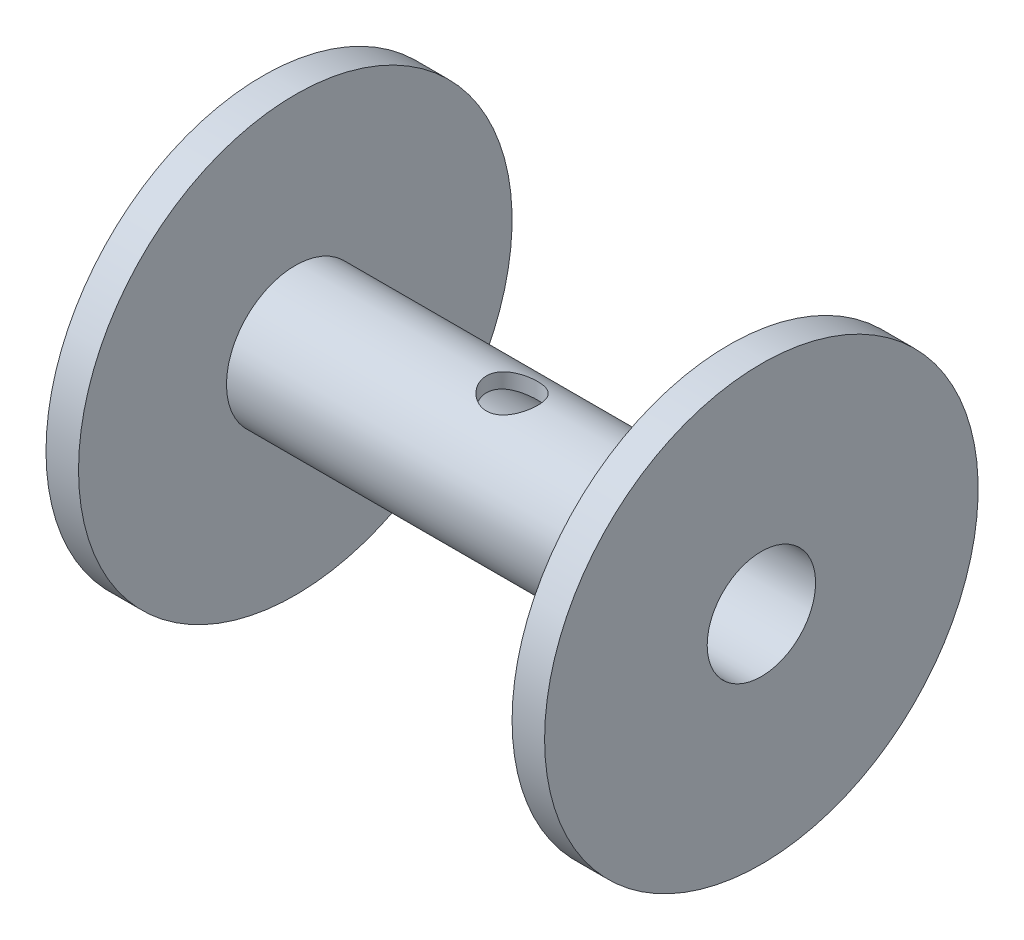
ISO-10303-21;
HEADER;
FILE_DESCRIPTION(('STEP AP214'),'2;1');
FILE_NAME('part.step','',(''),(''),'','','');
FILE_SCHEMA(('AUTOMOTIVE_DESIGN { 1 0 10303 214 1 1 1 1 }'));
ENDSEC;
DATA;
#1=APPLICATION_CONTEXT('core data for automotive mechanical design processes');
#2=APPLICATION_PROTOCOL_DEFINITION('international standard','automotive_design',2000,#1);
#3=PRODUCT_CONTEXT('',#1,'mechanical');
#4=PRODUCT('Part','Part','',(#3));
#5=PRODUCT_RELATED_PRODUCT_CATEGORY('part','',(#4));
#6=PRODUCT_DEFINITION_FORMATION('','',#4);
#7=PRODUCT_DEFINITION_CONTEXT('part definition',#1,'design');
#8=PRODUCT_DEFINITION('design','',#6,#7);
#9=PRODUCT_DEFINITION_SHAPE('','',#8);
#10=(LENGTH_UNIT() NAMED_UNIT(*) SI_UNIT(.MILLI.,.METRE.));
#11=(NAMED_UNIT(*) PLANE_ANGLE_UNIT() SI_UNIT($,.RADIAN.));
#12=(NAMED_UNIT(*) SI_UNIT($,.STERADIAN.) SOLID_ANGLE_UNIT());
#13=UNCERTAINTY_MEASURE_WITH_UNIT(LENGTH_MEASURE(1.E-05),#10,'distance_accuracy_value','');
#14=(GEOMETRIC_REPRESENTATION_CONTEXT(3) GLOBAL_UNCERTAINTY_ASSIGNED_CONTEXT((#13)) GLOBAL_UNIT_ASSIGNED_CONTEXT((#10,
#11,#12)) REPRESENTATION_CONTEXT('',''));
#15=CARTESIAN_POINT('',(0.,0.,0.));
#16=DIRECTION('',(0.,0.,1.));
#17=DIRECTION('',(1.,0.,0.));
#18=AXIS2_PLACEMENT_3D('',#15,#16,#17);
#19=CARTESIAN_POINT('',(-15.2755244755245,0.,0.));
#20=DIRECTION('',(-1.,0.,0.));
#21=DIRECTION('',(0.,0.,1.));
#22=AXIS2_PLACEMENT_3D('',#19,#20,#21);
#23=CYLINDRICAL_SURFACE('',#22,3.175);
#24=CARTESIAN_POINT('',(14.605,0.,0.));
#25=DIRECTION('',(-1.,0.,0.));
#26=DIRECTION('',(0.,0.,1.));
#27=AXIS2_PLACEMENT_3D('',#24,#25,#26);
#28=CIRCLE('',#27,3.175);
#29=CARTESIAN_POINT('',(14.605,0.,3.175));
#30=VERTEX_POINT('',#29);
#31=EDGE_CURVE('E76',#30,#30,#28,.T.);
#32=ORIENTED_EDGE('',*,*,#31,.F.);
#33=EDGE_LOOP('',(#32));
#34=FACE_BOUND('',#33,.T.);
#35=CARTESIAN_POINT('',(-14.605,0.,0.));
#36=DIRECTION('',(-1.,0.,0.));
#37=DIRECTION('',(0.,0.,1.));
#38=AXIS2_PLACEMENT_3D('',#35,#36,#37);
#39=CIRCLE('',#38,3.175);
#40=CARTESIAN_POINT('',(-14.605,0.,3.175));
#41=VERTEX_POINT('',#40);
#42=EDGE_CURVE('E70',#41,#41,#39,.T.);
#43=ORIENTED_EDGE('',*,*,#42,.T.);
#44=EDGE_LOOP('',(#43));
#45=FACE_BOUND('',#44,.T.);
#46=CARTESIAN_POINT('',(0.,2.7983253920872,-1.5));
#47=CARTESIAN_POINT('',(0.0788107476010317,2.79833097649977,-1.49999523547047));
#48=CARTESIAN_POINT('',(0.157735612205732,2.80170427159323,-1.49374832449328));
#49=CARTESIAN_POINT('',(0.313214667514685,2.81472644561665,-1.4690554061353));
#50=CARTESIAN_POINT('',(0.389762907162894,2.82438992585351,-1.45058101361493));
#51=CARTESIAN_POINT('',(0.537952673756733,2.84863009396432,-1.40237253355636));
#52=CARTESIAN_POINT('',(0.609616136431819,2.86318279906116,-1.37269332197988));
#53=CARTESIAN_POINT('',(0.74692939284759,2.89552502377023,-1.30308399064543));
#54=CARTESIAN_POINT('',(0.8125794422789,2.91331440566267,-1.26315430701281));
#55=CARTESIAN_POINT('',(0.941323245258398,2.95172227722859,-1.1707430871524));
#56=CARTESIAN_POINT('',(1.00387788849068,2.97245254188493,-1.11755658650795));
#57=CARTESIAN_POINT('',(1.11959143684936,3.01349951044786,-1.00161259672222));
#58=CARTESIAN_POINT('',(1.17274606260041,3.03381602228766,-0.938850772491945));
#59=CARTESIAN_POINT('',(1.27118937954777,3.07317288716969,-0.801034900704515));
#60=CARTESIAN_POINT('',(1.31583450125175,3.09206866660246,-0.725476017233364));
#61=CARTESIAN_POINT('',(1.39153752206176,3.12503381595021,-0.566861686619154));
#62=CARTESIAN_POINT('',(1.42260309774527,3.13910591174128,-0.483810507023549));
#63=CARTESIAN_POINT('',(1.46819431985617,3.16003750546179,-0.318263833167133));
#64=CARTESIAN_POINT('',(1.4836598006004,3.16730464125021,-0.23607983759682));
#65=CARTESIAN_POINT('',(1.50068669846295,3.17531500926786,-0.0699854874354078));
#66=CARTESIAN_POINT('',(1.50225551712034,3.17606171435844,0.0139239243031286));
#67=CARTESIAN_POINT('',(1.49185310738046,3.1711569999128,0.17410404695592));
#68=CARTESIAN_POINT('',(1.4809263684281,3.16599910390162,0.250460926307549));
#69=CARTESIAN_POINT('',(1.44768451199486,3.15058713309443,0.400106757592313));
#70=CARTESIAN_POINT('',(1.42536854800002,3.14033267949386,0.473395481043944));
#71=CARTESIAN_POINT('',(1.36978180811971,3.11549383971164,0.61616215999247));
#72=CARTESIAN_POINT('',(1.33635400002596,3.10084769916082,0.685567785451937));
#73=CARTESIAN_POINT('',(1.25968096352203,3.06858481389696,0.817962218284119));
#74=CARTESIAN_POINT('',(1.21643213988174,3.05096698193041,0.880948663490016));
#75=CARTESIAN_POINT('',(1.11701776567009,3.01265189942243,1.00453666893054));
#76=CARTESIAN_POINT('',(1.06005736803148,2.9918200943109,1.0644578414785));
#77=CARTESIAN_POINT('',(0.93699705964444,2.95046283361779,1.17424124933889));
#78=CARTESIAN_POINT('',(0.87089145595116,2.92993757775203,1.2240971710571));
#79=CARTESIAN_POINT('',(0.727172138151077,2.89039711066438,1.31484174230845));
#80=CARTESIAN_POINT('',(0.649138941996297,2.87151577260243,1.35512986365461));
#81=CARTESIAN_POINT('',(0.486283743531031,2.83914834140001,1.42170562946273));
#82=CARTESIAN_POINT('',(0.401468219875632,2.82565717160027,1.44800645544408));
#83=CARTESIAN_POINT('',(0.234253704737598,2.80697974613979,1.48387059914899));
#84=CARTESIAN_POINT('',(0.152157558069844,2.80124227464673,1.4945499135996));
#85=CARTESIAN_POINT('',(-0.0128364544628812,2.79714234532468,1.50221328025957));
#86=CARTESIAN_POINT('',(-0.0957338532268694,2.79877582206013,1.49920488189903));
#87=CARTESIAN_POINT('',(-0.25184110118071,2.80865284380239,1.4806017347564));
#88=CARTESIAN_POINT('',(-0.32523813353968,2.81627144126264,1.46619608896935));
#89=CARTESIAN_POINT('',(-0.468463633051388,2.83637948512089,1.42690562153975));
#90=CARTESIAN_POINT('',(-0.538291075738513,2.8488703210638,1.40201781025962));
#91=CARTESIAN_POINT('',(-0.676035807524976,2.87800314814948,1.3412324594274));
#92=CARTESIAN_POINT('',(-0.743715994140066,2.89481019393091,1.30487958898417));
#93=CARTESIAN_POINT('',(-0.872389828600745,2.93050507850425,1.22260967416881));
#94=CARTESIAN_POINT('',(-0.93338011780599,2.94939395301752,1.17668785898318));
#95=CARTESIAN_POINT('',(-1.05395122429284,2.98962533435876,1.07066250220429));
#96=CARTESIAN_POINT('',(-1.11263900919066,3.0110091844446,1.00955462247668));
#97=CARTESIAN_POINT('',(-1.2191662131219,3.05197816465585,0.877952835832725));
#98=CARTESIAN_POINT('',(-1.26700313884629,3.07156288076261,0.807456777596013));
#99=CARTESIAN_POINT('',(-1.35106340432696,3.10717258491727,0.657374049291596));
#100=CARTESIAN_POINT('',(-1.38708244177874,3.12313361565429,0.577656753882327));
#101=CARTESIAN_POINT('',(-1.44486593502356,3.14922093597641,0.412327293299583));
#102=CARTESIAN_POINT('',(-1.46664154231209,3.15935178938716,0.326719797872878));
#103=CARTESIAN_POINT('',(-1.49363889435459,3.17197971044583,0.159896332874223));
#104=CARTESIAN_POINT('',(-1.50011013632642,3.17505233840112,0.078925398284078));
#105=CARTESIAN_POINT('',(-1.49988711965684,3.17494636529876,-0.0829833461657175));
#106=CARTESIAN_POINT('',(-1.49319653511093,3.17176950877122,-0.163921158963004));
#107=CARTESIAN_POINT('',(-1.46770848023088,3.15985410378094,-0.318841842835547));
#108=CARTESIAN_POINT('',(-1.44959197491994,3.15142868675494,-0.392963167600614));
#109=CARTESIAN_POINT('',(-1.40262108547478,3.13010132928976,-0.537026434022491));
#110=CARTESIAN_POINT('',(-1.37376499240882,3.1171986764347,-0.60696770847403));
#111=CARTESIAN_POINT('',(-1.30473490189286,3.08738510301285,-0.744198443618439));
#112=CARTESIAN_POINT('',(-1.26410939390821,3.0703197298679,-0.811226286131094));
#113=CARTESIAN_POINT('',(-1.17328432091972,3.03405477724481,-0.937805412907553));
#114=CARTESIAN_POINT('',(-1.12308040855481,3.01485423033003,-0.997353281796323));
#115=CARTESIAN_POINT('',(-1.00928446778082,2.97425749382228,-1.11287613406119));
#116=CARTESIAN_POINT('',(-0.944896373173603,2.9528185885393,-1.16805442942683));
#117=CARTESIAN_POINT('',(-0.807312145748489,2.91171333700677,-1.26705651381277));
#118=CARTESIAN_POINT('',(-0.734109598744511,2.89204830000693,-1.31087196019013));
#119=CARTESIAN_POINT('',(-0.579232422210802,2.85663554941127,-1.3863737982034));
#120=CARTESIAN_POINT('',(-0.497439352525226,2.84095675906997,-1.41785130272302));
#121=CARTESIAN_POINT('',(-0.328811998329219,2.81635628214136,-1.4661232120466));
#122=CARTESIAN_POINT('',(-0.241995696672077,2.80741192483264,-1.48296690968124));
#123=CARTESIAN_POINT('',(-0.128694633247988,2.80116429672363,-1.49469268672873));
#124=CARTESIAN_POINT('',(-0.10301180774758,2.80010260103933,-1.49668048940514));
#125=CARTESIAN_POINT('',(-0.0515567295081782,2.79868221732461,-1.49933495903092));
#126=CARTESIAN_POINT('',(-0.0257844722890938,2.79832356503778,-1.50000155880871));
#127=CARTESIAN_POINT('',(0.,2.7983253920872,-1.5));
#128=B_SPLINE_CURVE_WITH_KNOTS('',3,(#46,#47,#48,#49,#50,#51,#52,#53,#54,#55,#56,#57,#58,#59,
#60,#61,#62,#63,#64,#65,#66,#67,#68,#69,#70,#71,#72,#73,#74,#75,#76,#77,#78,#79,#80,#81,#82,#83,
#84,#85,#86,#87,#88,#89,#90,#91,#92,#93,#94,#95,#96,#97,#98,#99,#100,#101,#102,#103,#104,#105,
#106,#107,#108,#109,#110,#111,#112,#113,#114,#115,#116,#117,#118,#119,#120,#121,#122,#123,#124,
#125,#126,#127),.UNSPECIFIED.,.T.,.F.,(4,2,2,2,2,2,2,2,2,2,2,2,2,2,2,2,2,2,2,2,2,2,2,2,2,2,2,2,
2,2,2,2,2,2,2,2,2,2,2,2,4),(0.,0.236323871838544,0.473198284289302,0.708927337380699,
0.944646362603916,1.19762429635865,1.45071710395354,1.71864285343498,1.98641694681215,
2.23687152724756,2.48719270436037,2.71802817018661,2.94888079555674,3.1831453100556,
3.41749572162706,3.67216706074964,3.92699765369087,4.19506898546716,4.46288723920479,
4.71043828617548,4.95785281342715,5.18239796950746,5.40700721193729,5.64198832122139,
5.87708686716682,6.13804637958085,6.39906579463174,6.66438519401193,6.92949661955738,
7.17207877892644,7.41459323161728,7.64386670961211,7.87317668624822,8.11282240294707,
8.35257714778319,8.61378861881715,8.87519133270404,9.14084608292566,9.40560248746477,
9.48291651801969,9.56023447921351),.UNSPECIFIED.);
#129=CARTESIAN_POINT('',(0.,2.7983253920872,-1.5));
#130=VERTEX_POINT('',#129);
#131=EDGE_CURVE('E96',#130,#130,#128,.T.);
#132=ORIENTED_EDGE('',*,*,#131,.F.);
#133=EDGE_LOOP('',(#132));
#134=FACE_BOUND('',#133,.T.);
#135=ADVANCED_FACE('F51',(#34,#45,#134),#23,.F.);
#136=CARTESIAN_POINT('',(-15.2755244755245,0.,0.));
#137=DIRECTION('',(-1.,0.,0.));
#138=DIRECTION('',(0.,0.,1.));
#139=AXIS2_PLACEMENT_3D('',#136,#137,#138);
#140=CYLINDRICAL_SURFACE('',#139,4.03225);
#141=CARTESIAN_POINT('',(-12.7,0.,0.));
#142=DIRECTION('',(-1.,0.,0.));
#143=DIRECTION('',(0.,0.,1.));
#144=AXIS2_PLACEMENT_3D('',#141,#142,#143);
#145=CIRCLE('',#144,4.03225);
#146=CARTESIAN_POINT('',(-12.7,0.,4.03225));
#147=VERTEX_POINT('',#146);
#148=EDGE_CURVE('E92',#147,#147,#145,.T.);
#149=ORIENTED_EDGE('',*,*,#148,.F.);
#150=EDGE_LOOP('',(#149));
#151=FACE_BOUND('',#150,.T.);
#152=CARTESIAN_POINT('',(12.7,0.,0.));
#153=DIRECTION('',(-1.,0.,0.));
#154=DIRECTION('',(0.,0.,1.));
#155=AXIS2_PLACEMENT_3D('',#152,#153,#154);
#156=CIRCLE('',#155,4.03225);
#157=CARTESIAN_POINT('',(12.7,0.,4.03225));
#158=VERTEX_POINT('',#157);
#159=EDGE_CURVE('E88',#158,#158,#156,.T.);
#160=ORIENTED_EDGE('',*,*,#159,.T.);
#161=EDGE_LOOP('',(#160));
#162=FACE_BOUND('',#161,.T.);
#163=CARTESIAN_POINT('',(0.,3.74286522099046,-1.5));
#164=CARTESIAN_POINT('',(0.0810605082532311,3.74286262545742,-1.50000280860716));
#165=CARTESIAN_POINT('',(0.162102326967374,3.74552715792148,-1.49340731690282));
#166=CARTESIAN_POINT('',(0.321745734418679,3.75582400206754,-1.46731743450885));
#167=CARTESIAN_POINT('',(0.400347365104893,3.76345622830077,-1.44782326568791));
#168=CARTESIAN_POINT('',(0.552761522089942,3.78270682523499,-1.39674760930536));
#169=CARTESIAN_POINT('',(0.626584881752979,3.79431577447426,-1.36519467055229));
#170=CARTESIAN_POINT('',(0.767918696133514,3.82019671649696,-1.29099805093523));
#171=CARTESIAN_POINT('',(0.83542727939898,3.83446949500481,-1.24835109630931));
#172=CARTESIAN_POINT('',(0.965516163547924,3.86485187022262,-1.15094362675974));
#173=CARTESIAN_POINT('',(1.02774394846759,3.88101491695662,-1.09572887260401));
#174=CARTESIAN_POINT('',(1.14230456469602,3.91291033270932,-0.975717349532377));
#175=CARTESIAN_POINT('',(1.19463532821201,3.92864261114133,-0.910918583249523));
#176=CARTESIAN_POINT('',(1.28960700367383,3.9585379830802,-0.770910034768358));
#177=CARTESIAN_POINT('',(1.33186577238466,3.97263109085241,-0.695424754317507));
#178=CARTESIAN_POINT('',(1.40293902026793,3.99701868248392,-0.537799779474619));
#179=CARTESIAN_POINT('',(1.43175808219767,4.0073144609301,-0.455662364599041));
#180=CARTESIAN_POINT('',(1.47390058439084,4.0225679708103,-0.290770071921704));
#181=CARTESIAN_POINT('',(1.48783069408348,4.02773402720598,-0.208189890177394));
#182=CARTESIAN_POINT('',(1.50174259763788,4.03289304013209,-0.041713164447472));
#183=CARTESIAN_POINT('',(1.50172885505794,4.03288765209057,0.0421829496963453));
#184=CARTESIAN_POINT('',(1.48810912560577,4.02783755319846,0.204565721615127));
#185=CARTESIAN_POINT('',(1.47516507686668,4.0230382565197,0.283116851808199));
#186=CARTESIAN_POINT('',(1.43716422426303,4.00926043121792,0.436840120553872));
#187=CARTESIAN_POINT('',(1.41210656430194,4.00028160721984,0.512012019878063));
#188=CARTESIAN_POINT('',(1.35027656141209,3.97887378010392,0.658133625501671));
#189=CARTESIAN_POINT('',(1.31333993478245,3.96639672742092,0.729006486143544));
#190=CARTESIAN_POINT('',(1.22894508281966,3.93925779087783,0.863722898343242));
#191=CARTESIAN_POINT('',(1.18148349340397,3.92459520895176,0.927564192622355));
#192=CARTESIAN_POINT('',(1.07418544513035,3.89360117668711,1.05030799530885));
#193=CARTESIAN_POINT('',(1.01379320776523,3.87722224784568,1.10871341413277));
#194=CARTESIAN_POINT('',(0.883969759515727,3.84532037315715,1.21475290171194));
#195=CARTESIAN_POINT('',(0.814536358844123,3.82979763598216,1.26238435331695));
#196=CARTESIAN_POINT('',(0.666669776417092,3.80106928483374,1.34645283888991));
#197=CARTESIAN_POINT('',(0.58807496744726,3.78792077737118,1.38262667399653));
#198=CARTESIAN_POINT('',(0.425291566528801,3.7660895474432,1.44103907782427));
#199=CARTESIAN_POINT('',(0.341106055494909,3.75740438800916,1.46328525243885));
#200=CARTESIAN_POINT('',(0.174436686737479,3.74605633474948,1.49208917152611));
#201=CARTESIAN_POINT('',(0.0921097825418008,3.74309126805202,1.49943522240061));
#202=CARTESIAN_POINT('',(-0.0726357872383872,3.74266450431823,1.50050157116152));
#203=CARTESIAN_POINT('',(-0.155054425499946,3.74520146331211,1.49422519657268));
#204=CARTESIAN_POINT('',(-0.313636161157434,3.75518641964114,1.46893918100132));
#205=CARTESIAN_POINT('',(-0.389912048859508,3.76240099881889,1.45053409371867));
#206=CARTESIAN_POINT('',(-0.538259662800263,3.78065295701139,1.40227106523146));
#207=CARTESIAN_POINT('',(-0.610330532611422,3.79169111161244,1.37241080028978));
#208=CARTESIAN_POINT('',(-0.751194437864135,3.81685037763863,1.3008378099256));
#209=CARTESIAN_POINT('',(-0.819766741365623,3.83107065410563,1.25872654174382));
#210=CARTESIAN_POINT('',(-0.94915198555367,3.86082337186448,1.16427295076222));
#211=CARTESIAN_POINT('',(-1.00996211258778,3.87635628559249,1.11192693535525));
#212=CARTESIAN_POINT('',(-1.12601959259903,3.90815180773579,0.994635805675168));
#213=CARTESIAN_POINT('',(-1.18068563392994,3.92439970491397,0.92910952612849));
#214=CARTESIAN_POINT('',(-1.27831314836227,3.95486645770156,0.789414546656814));
#215=CARTESIAN_POINT('',(-1.32127462725588,3.96908531431507,0.715245851008674));
#216=CARTESIAN_POINT('',(-1.39397932428762,3.99387671518709,0.560448512840235));
#217=CARTESIAN_POINT('',(-1.42377184687962,4.00446282651824,0.4798453232322));
#218=CARTESIAN_POINT('',(-1.46921124897475,4.02084161942864,0.314288679595201));
#219=CARTESIAN_POINT('',(-1.48486465693151,4.02663651315213,0.229337252443971));
#220=CARTESIAN_POINT('',(-1.50088594823427,4.03257352309592,0.0627542440502475));
#221=CARTESIAN_POINT('',(-1.50208033338205,4.0330212699538,-0.0187876739602743));
#222=CARTESIAN_POINT('',(-1.49126909256499,4.0290070750733,-0.180860052366927));
#223=CARTESIAN_POINT('',(-1.47926501596501,4.02454570961462,-0.261390630361758));
#224=CARTESIAN_POINT('',(-1.4429761283355,4.01135207395564,-0.417218372620462));
#225=CARTESIAN_POINT('',(-1.41898911418693,4.00272353041785,-0.492594335669173));
#226=CARTESIAN_POINT('',(-1.3597100380317,3.98209514191057,-0.63825977639419));
#227=CARTESIAN_POINT('',(-1.32441583771856,3.97009465932517,-0.70854828889602));
#228=CARTESIAN_POINT('',(-1.24184728584167,3.94330311481887,-0.845254878885198));
#229=CARTESIAN_POINT('',(-1.1941345034695,3.92841650746543,-0.9113890861302));
#230=CARTESIAN_POINT('',(-1.08877832872892,3.89768413406652,-1.03496879561156));
#231=CARTESIAN_POINT('',(-1.03113141506256,3.88183802920943,-1.09241120330676));
#232=CARTESIAN_POINT('',(-0.903995918687687,3.84997088966022,-1.2000328015016));
#233=CARTESIAN_POINT('',(-0.834049003047494,3.83398321642173,-1.24968249159921));
#234=CARTESIAN_POINT('',(-0.686298727869584,3.80457800119995,-1.33653922685383));
#235=CARTESIAN_POINT('',(-0.608494793409266,3.79116064750339,-1.37374536061682));
#236=CARTESIAN_POINT('',(-0.444079552137688,3.76820874872597,-1.43554225419766));
#237=CARTESIAN_POINT('',(-0.357248878006704,3.75883624891752,-1.45961526901652));
#238=CARTESIAN_POINT('',(-0.180269683072115,3.74616784322325,-1.49183756142673));
#239=CARTESIAN_POINT('',(-0.0901232904178125,3.74286810671106,-1.49999687738303));
#240=CARTESIAN_POINT('',(0.,3.74286522099046,-1.5));
#241=B_SPLINE_CURVE_WITH_KNOTS('',3,(#163,#164,#165,#166,#167,#168,#169,#170,#171,#172,#173,
#174,#175,#176,#177,#178,#179,#180,#181,#182,#183,#184,#185,#186,#187,#188,#189,#190,#191,#192,
#193,#194,#195,#196,#197,#198,#199,#200,#201,#202,#203,#204,#205,#206,#207,#208,#209,#210,#211,
#212,#213,#214,#215,#216,#217,#218,#219,#220,#221,#222,#223,#224,#225,#226,#227,#228,#229,#230,
#231,#232,#233,#234,#235,#236,#237,#238,#239,#240),.UNSPECIFIED.,.T.,.F.,(4,2,2,2,2,2,2,2,2,2,2,
2,2,2,2,2,2,2,2,2,2,2,2,2,2,2,2,2,2,2,2,2,2,2,2,2,2,2,4),(0.,0.242846066218496,0.48568795537789,
0.727958449217654,0.97030051654549,1.22341624487427,1.47658479859802,1.73821156443558,
1.99974905375499,2.25016799334158,2.5005067714948,2.73865472806768,2.97681951756097,
3.21843095972489,3.46011973949005,3.71574562239636,3.97143353394805,4.23262841230694,
4.49368052747468,4.74051782572097,4.98729483626132,5.2226173653398,5.45798765597308,
5.70208814363682,5.94627686367409,6.20565491167122,6.46503283131093,6.7234312422891,
6.981710281885,7.22515095079881,7.46856304531068,7.70620625603547,7.94389443411667,
8.1915002919112,8.43919409843272,8.69970220653851,8.96022939066739,9.2303967750537,
9.5003936826016),.UNSPECIFIED.);
#242=CARTESIAN_POINT('',(0.,3.74286522099046,-1.5));
#243=VERTEX_POINT('',#242);
#244=EDGE_CURVE('E55',#243,#243,#241,.T.);
#245=ORIENTED_EDGE('',*,*,#244,.T.);
#246=EDGE_LOOP('',(#245));
#247=FACE_BOUND('',#246,.T.);
#248=ADVANCED_FACE('F111',(#151,#162,#247),#140,.T.);
#249=CARTESIAN_POINT('',(-12.7,0.,0.));
#250=DIRECTION('',(1.,0.,0.));
#251=DIRECTION('',(0.,0.,-1.));
#252=AXIS2_PLACEMENT_3D('',#249,#250,#251);
#253=PLANE('',#252);
#254=ORIENTED_EDGE('',*,*,#148,.T.);
#255=EDGE_LOOP('',(#254));
#256=FACE_BOUND('',#255,.T.);
#257=CARTESIAN_POINT('',(-12.7,0.,0.));
#258=DIRECTION('',(-1.,0.,0.));
#259=DIRECTION('',(0.,0.,1.));
#260=AXIS2_PLACEMENT_3D('',#257,#258,#259);
#261=CIRCLE('',#260,12.7);
#262=CARTESIAN_POINT('',(-12.7,0.,12.7));
#263=VERTEX_POINT('',#262);
#264=EDGE_CURVE('E10',#263,#263,#261,.T.);
#265=ORIENTED_EDGE('',*,*,#264,.F.);
#266=EDGE_LOOP('',(#265));
#267=FACE_BOUND('',#266,.T.);
#268=ADVANCED_FACE('F53',(#256,#267),#253,.T.);
#269=CARTESIAN_POINT('',(-15.2755244755245,0.,0.));
#270=DIRECTION('',(-1.,0.,0.));
#271=DIRECTION('',(0.,0.,1.));
#272=AXIS2_PLACEMENT_3D('',#269,#270,#271);
#273=CYLINDRICAL_SURFACE('',#272,12.7);
#274=ORIENTED_EDGE('',*,*,#264,.T.);
#275=EDGE_LOOP('',(#274));
#276=FACE_BOUND('',#275,.T.);
#277=CARTESIAN_POINT('',(-14.605,0.,0.));
#278=DIRECTION('',(-1.,0.,0.));
#279=DIRECTION('',(0.,0.,1.));
#280=AXIS2_PLACEMENT_3D('',#277,#278,#279);
#281=CIRCLE('',#280,12.7);
#282=CARTESIAN_POINT('',(-14.605,0.,12.7));
#283=VERTEX_POINT('',#282);
#284=EDGE_CURVE('E65',#283,#283,#281,.T.);
#285=ORIENTED_EDGE('',*,*,#284,.F.);
#286=EDGE_LOOP('',(#285));
#287=FACE_BOUND('',#286,.T.);
#288=ADVANCED_FACE('F130',(#276,#287),#273,.T.);
#289=CARTESIAN_POINT('',(-14.605,0.,0.));
#290=DIRECTION('',(1.,0.,0.));
#291=DIRECTION('',(0.,0.,-1.));
#292=AXIS2_PLACEMENT_3D('',#289,#290,#291);
#293=PLANE('',#292);
#294=ORIENTED_EDGE('',*,*,#42,.F.);
#295=EDGE_LOOP('',(#294));
#296=FACE_BOUND('',#295,.T.);
#297=ORIENTED_EDGE('',*,*,#284,.T.);
#298=EDGE_LOOP('',(#297));
#299=FACE_BOUND('',#298,.T.);
#300=ADVANCED_FACE('F125',(#296,#299),#293,.F.);
#301=CARTESIAN_POINT('',(14.605,0.,0.));
#302=DIRECTION('',(1.,0.,0.));
#303=DIRECTION('',(0.,0.,-1.));
#304=AXIS2_PLACEMENT_3D('',#301,#302,#303);
#305=PLANE('',#304);
#306=ORIENTED_EDGE('',*,*,#31,.T.);
#307=EDGE_LOOP('',(#306));
#308=FACE_BOUND('',#307,.T.);
#309=CARTESIAN_POINT('',(14.605,0.,0.));
#310=DIRECTION('',(-1.,0.,0.));
#311=DIRECTION('',(0.,0.,1.));
#312=AXIS2_PLACEMENT_3D('',#309,#310,#311);
#313=CIRCLE('',#312,12.7);
#314=CARTESIAN_POINT('',(14.605,0.,12.7));
#315=VERTEX_POINT('',#314);
#316=EDGE_CURVE('E80',#315,#315,#313,.T.);
#317=ORIENTED_EDGE('',*,*,#316,.F.);
#318=EDGE_LOOP('',(#317));
#319=FACE_BOUND('',#318,.T.);
#320=ADVANCED_FACE('F122',(#308,#319),#305,.T.);
#321=CARTESIAN_POINT('',(-15.2755244755245,0.,0.));
#322=DIRECTION('',(-1.,0.,0.));
#323=DIRECTION('',(0.,0.,1.));
#324=AXIS2_PLACEMENT_3D('',#321,#322,#323);
#325=CYLINDRICAL_SURFACE('',#324,12.7);
#326=CARTESIAN_POINT('',(12.7,0.,0.));
#327=DIRECTION('',(-1.,0.,0.));
#328=DIRECTION('',(0.,0.,1.));
#329=AXIS2_PLACEMENT_3D('',#326,#327,#328);
#330=CIRCLE('',#329,12.7);
#331=CARTESIAN_POINT('',(12.7,0.,12.7));
#332=VERTEX_POINT('',#331);
#333=EDGE_CURVE('E84',#332,#332,#330,.T.);
#334=ORIENTED_EDGE('',*,*,#333,.F.);
#335=EDGE_LOOP('',(#334));
#336=FACE_BOUND('',#335,.T.);
#337=ORIENTED_EDGE('',*,*,#316,.T.);
#338=EDGE_LOOP('',(#337));
#339=FACE_BOUND('',#338,.T.);
#340=ADVANCED_FACE('F119',(#336,#339),#325,.T.);
#341=CARTESIAN_POINT('',(12.7,0.,0.));
#342=DIRECTION('',(1.,0.,0.));
#343=DIRECTION('',(0.,0.,-1.));
#344=AXIS2_PLACEMENT_3D('',#341,#342,#343);
#345=PLANE('',#344);
#346=ORIENTED_EDGE('',*,*,#159,.F.);
#347=EDGE_LOOP('',(#346));
#348=FACE_BOUND('',#347,.T.);
#349=ORIENTED_EDGE('',*,*,#333,.T.);
#350=EDGE_LOOP('',(#349));
#351=FACE_BOUND('',#350,.T.);
#352=ADVANCED_FACE('F109',(#348,#351),#345,.F.);
#353=CARTESIAN_POINT('',(0.,12.7,0.));
#354=DIRECTION('',(0.,-1.,0.));
#355=DIRECTION('',(0.,0.,-1.));
#356=AXIS2_PLACEMENT_3D('',#353,#354,#355);
#357=CYLINDRICAL_SURFACE('',#356,1.5);
#358=ORIENTED_EDGE('',*,*,#244,.F.);
#359=EDGE_LOOP('',(#358));
#360=FACE_BOUND('',#359,.T.);
#361=ORIENTED_EDGE('',*,*,#131,.T.);
#362=EDGE_LOOP('',(#361));
#363=FACE_BOUND('',#362,.T.);
#364=ADVANCED_FACE('F106',(#360,#363),#357,.F.);
#365=CLOSED_SHELL('',(#135,#248,#268,#288,#300,#320,#340,#352,#364));
#366=MANIFOLD_SOLID_BREP('B2',#365);
#367=ADVANCED_BREP_SHAPE_REPRESENTATION('',(#18,#366),#14);
#368=SHAPE_DEFINITION_REPRESENTATION(#9,#367);
ENDSEC;
END-ISO-10303-21;
